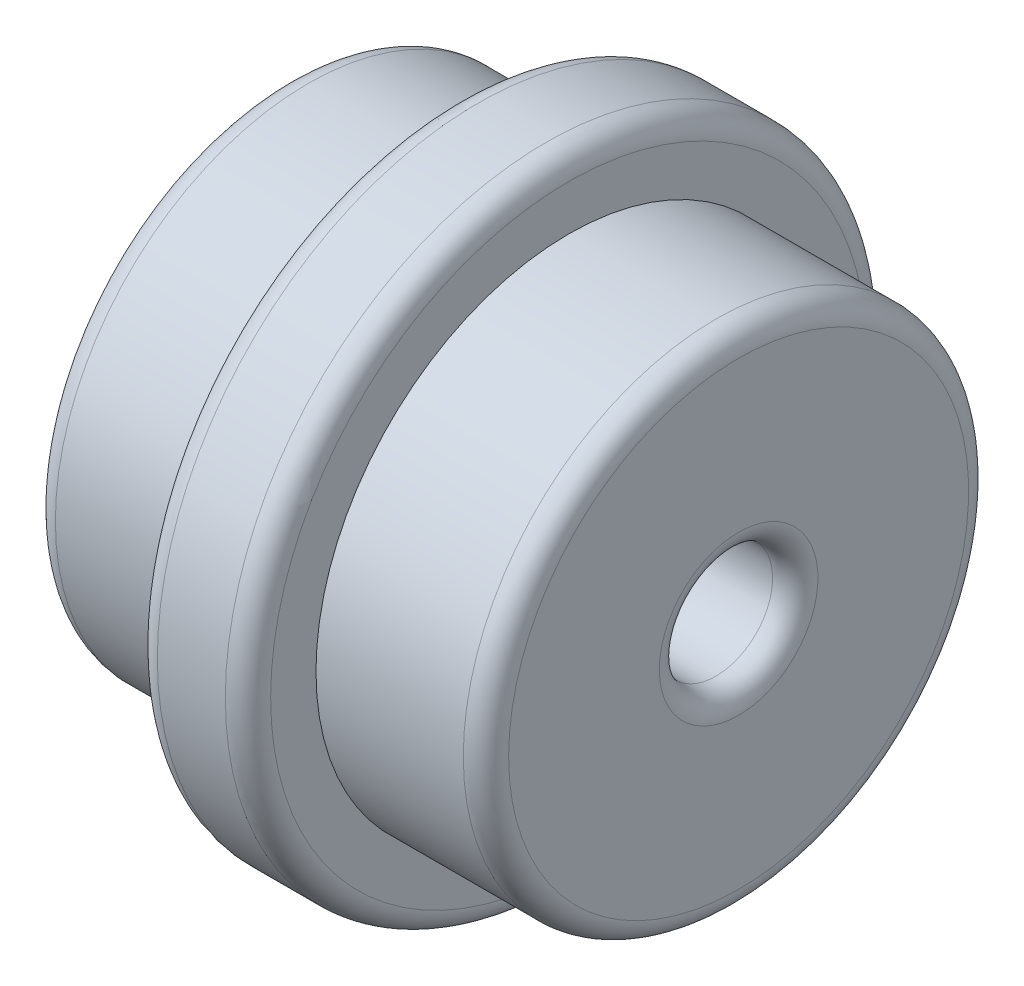
ISO-10303-21;
HEADER;
FILE_DESCRIPTION(('STEP AP214'),'2;1');
FILE_NAME('part.step','',(''),(''),'','','');
FILE_SCHEMA(('AUTOMOTIVE_DESIGN { 1 0 10303 214 1 1 1 1 }'));
ENDSEC;
DATA;
#1=APPLICATION_CONTEXT('core data for automotive mechanical design processes');
#2=APPLICATION_PROTOCOL_DEFINITION('international standard','automotive_design',2000,#1);
#3=PRODUCT_CONTEXT('',#1,'mechanical');
#4=PRODUCT('Part','Part','',(#3));
#5=PRODUCT_RELATED_PRODUCT_CATEGORY('part','',(#4));
#6=PRODUCT_DEFINITION_FORMATION('','',#4);
#7=PRODUCT_DEFINITION_CONTEXT('part definition',#1,'design');
#8=PRODUCT_DEFINITION('design','',#6,#7);
#9=PRODUCT_DEFINITION_SHAPE('','',#8);
#10=(LENGTH_UNIT() NAMED_UNIT(*) SI_UNIT(.MILLI.,.METRE.));
#11=(NAMED_UNIT(*) PLANE_ANGLE_UNIT() SI_UNIT($,.RADIAN.));
#12=(NAMED_UNIT(*) SI_UNIT($,.STERADIAN.) SOLID_ANGLE_UNIT());
#13=UNCERTAINTY_MEASURE_WITH_UNIT(LENGTH_MEASURE(1.E-05),#10,'distance_accuracy_value','');
#14=(GEOMETRIC_REPRESENTATION_CONTEXT(3) GLOBAL_UNCERTAINTY_ASSIGNED_CONTEXT((#13)) GLOBAL_UNIT_ASSIGNED_CONTEXT((#10,
#11,#12)) REPRESENTATION_CONTEXT('',''));
#15=CARTESIAN_POINT('',(0.,0.,0.));
#16=DIRECTION('',(0.,0.,1.));
#17=DIRECTION('',(1.,0.,0.));
#18=AXIS2_PLACEMENT_3D('',#15,#16,#17);
#19=CARTESIAN_POINT('',(-10.,11.15,0.));
#20=DIRECTION('',(1.,0.,0.));
#21=DIRECTION('',(0.,0.,-1.));
#22=AXIS2_PLACEMENT_3D('',#19,#20,#21);
#23=PLANE('',#22);
#24=CARTESIAN_POINT('',(-10.,0.,0.));
#25=DIRECTION('',(1.,0.,0.));
#26=DIRECTION('',(0.,0.,-1.));
#27=AXIS2_PLACEMENT_3D('',#24,#25,#26);
#28=CIRCLE('',#27,3.5);
#29=CARTESIAN_POINT('',(-10.,0.,-3.5));
#30=VERTEX_POINT('',#29);
#31=EDGE_CURVE('E37',#30,#30,#28,.T.);
#32=ORIENTED_EDGE('',*,*,#31,.T.);
#33=EDGE_LOOP('',(#32));
#34=FACE_BOUND('',#33,.T.);
#35=CARTESIAN_POINT('',(-10.,0.,0.));
#36=DIRECTION('',(1.,0.,0.));
#37=DIRECTION('',(0.,0.,-1.));
#38=AXIS2_PLACEMENT_3D('',#35,#36,#37);
#39=CIRCLE('',#38,10.15);
#40=CARTESIAN_POINT('',(-10.,0.,-10.15));
#41=VERTEX_POINT('',#40);
#42=EDGE_CURVE('E65',#41,#41,#39,.F.);
#43=ORIENTED_EDGE('',*,*,#42,.T.);
#44=EDGE_LOOP('',(#43));
#45=FACE_BOUND('',#44,.T.);
#46=ADVANCED_FACE('F30',(#34,#45),#23,.F.);
#47=CARTESIAN_POINT('',(10.,0.,0.));
#48=DIRECTION('',(-1.,0.,0.));
#49=DIRECTION('',(0.,0.,1.));
#50=AXIS2_PLACEMENT_3D('',#47,#48,#49);
#51=PLANE('',#50);
#52=CARTESIAN_POINT('',(10.,0.,0.));
#53=DIRECTION('',(-1.,0.,0.));
#54=DIRECTION('',(0.,0.,1.));
#55=AXIS2_PLACEMENT_3D('',#52,#53,#54);
#56=CIRCLE('',#55,3.5);
#57=CARTESIAN_POINT('',(10.,0.,3.5));
#58=VERTEX_POINT('',#57);
#59=EDGE_CURVE('E10',#58,#58,#56,.T.);
#60=ORIENTED_EDGE('',*,*,#59,.T.);
#61=EDGE_LOOP('',(#60));
#62=FACE_BOUND('',#61,.T.);
#63=CARTESIAN_POINT('',(10.,0.,0.));
#64=DIRECTION('',(-1.,0.,0.));
#65=DIRECTION('',(0.,0.,1.));
#66=AXIS2_PLACEMENT_3D('',#63,#64,#65);
#67=CIRCLE('',#66,10.15);
#68=CARTESIAN_POINT('',(10.,0.,10.15));
#69=VERTEX_POINT('',#68);
#70=EDGE_CURVE('E68',#69,#69,#67,.F.);
#71=ORIENTED_EDGE('',*,*,#70,.T.);
#72=EDGE_LOOP('',(#71));
#73=FACE_BOUND('',#72,.T.);
#74=ADVANCED_FACE('F99',(#62,#73),#51,.F.);
#75=CARTESIAN_POINT('',(-10.,0.,0.));
#76=DIRECTION('',(-1.,0.,0.));
#77=DIRECTION('',(0.,0.,1.));
#78=AXIS2_PLACEMENT_3D('',#75,#76,#77);
#79=CYLINDRICAL_SURFACE('',#78,11.15);
#80=CARTESIAN_POINT('',(9.,0.,0.));
#81=DIRECTION('',(-1.,0.,0.));
#82=DIRECTION('',(0.,0.,1.));
#83=AXIS2_PLACEMENT_3D('',#80,#81,#82);
#84=CIRCLE('',#83,11.15);
#85=CARTESIAN_POINT('',(9.,0.,11.15));
#86=VERTEX_POINT('',#85);
#87=EDGE_CURVE('E71',#86,#86,#84,.T.);
#88=ORIENTED_EDGE('',*,*,#87,.T.);
#89=EDGE_LOOP('',(#88));
#90=FACE_BOUND('',#89,.T.);
#91=CARTESIAN_POINT('',(2.5,0.,0.));
#92=DIRECTION('',(-1.,0.,0.));
#93=DIRECTION('',(0.,0.,1.));
#94=AXIS2_PLACEMENT_3D('',#91,#92,#93);
#95=CIRCLE('',#94,11.15);
#96=CARTESIAN_POINT('',(2.5,0.,11.15));
#97=VERTEX_POINT('',#96);
#98=EDGE_CURVE('E74',#97,#97,#95,.T.);
#99=ORIENTED_EDGE('',*,*,#98,.F.);
#100=EDGE_LOOP('',(#99));
#101=FACE_BOUND('',#100,.T.);
#102=ADVANCED_FACE('F104',(#90,#101),#79,.T.);
#103=CARTESIAN_POINT('',(2.5,11.15,0.));
#104=DIRECTION('',(-1.,0.,0.));
#105=DIRECTION('',(0.,0.,1.));
#106=AXIS2_PLACEMENT_3D('',#103,#104,#105);
#107=PLANE('',#106);
#108=CARTESIAN_POINT('',(2.5,0.,0.));
#109=DIRECTION('',(-1.,0.,0.));
#110=DIRECTION('',(0.,0.,1.));
#111=AXIS2_PLACEMENT_3D('',#108,#109,#110);
#112=CIRCLE('',#111,13.15);
#113=CARTESIAN_POINT('',(2.5,0.,13.15));
#114=VERTEX_POINT('',#113);
#115=EDGE_CURVE('E53',#114,#114,#112,.F.);
#116=ORIENTED_EDGE('',*,*,#115,.T.);
#117=EDGE_LOOP('',(#116));
#118=FACE_BOUND('',#117,.T.);
#119=ORIENTED_EDGE('',*,*,#98,.T.);
#120=EDGE_LOOP('',(#119));
#121=FACE_BOUND('',#120,.T.);
#122=ADVANCED_FACE('F95',(#118,#121),#107,.F.);
#123=CARTESIAN_POINT('',(-10.,0.,0.));
#124=DIRECTION('',(-1.,0.,0.));
#125=DIRECTION('',(0.,0.,1.));
#126=AXIS2_PLACEMENT_3D('',#123,#124,#125);
#127=CYLINDRICAL_SURFACE('',#126,14.15);
#128=CARTESIAN_POINT('',(1.5,0.,0.));
#129=DIRECTION('',(-1.,0.,0.));
#130=DIRECTION('',(0.,0.,1.));
#131=AXIS2_PLACEMENT_3D('',#128,#129,#130);
#132=CIRCLE('',#131,14.15);
#133=CARTESIAN_POINT('',(1.5,0.,14.15));
#134=VERTEX_POINT('',#133);
#135=EDGE_CURVE('E56',#134,#134,#132,.T.);
#136=ORIENTED_EDGE('',*,*,#135,.T.);
#137=EDGE_LOOP('',(#136));
#138=FACE_BOUND('',#137,.T.);
#139=CARTESIAN_POINT('',(-1.5,0.,0.));
#140=DIRECTION('',(1.,0.,0.));
#141=DIRECTION('',(0.,0.,-1.));
#142=AXIS2_PLACEMENT_3D('',#139,#140,#141);
#143=CIRCLE('',#142,14.15);
#144=CARTESIAN_POINT('',(-1.5,0.,-14.15));
#145=VERTEX_POINT('',#144);
#146=EDGE_CURVE('E59',#145,#145,#143,.T.);
#147=ORIENTED_EDGE('',*,*,#146,.T.);
#148=EDGE_LOOP('',(#147));
#149=FACE_BOUND('',#148,.T.);
#150=ADVANCED_FACE('F85',(#138,#149),#127,.T.);
#151=CARTESIAN_POINT('',(-2.5,14.15,0.));
#152=DIRECTION('',(1.,0.,0.));
#153=DIRECTION('',(0.,0.,-1.));
#154=AXIS2_PLACEMENT_3D('',#151,#152,#153);
#155=PLANE('',#154);
#156=CARTESIAN_POINT('',(-2.5,0.,0.));
#157=DIRECTION('',(1.,0.,0.));
#158=DIRECTION('',(0.,0.,-1.));
#159=AXIS2_PLACEMENT_3D('',#156,#157,#158);
#160=CIRCLE('',#159,13.15);
#161=CARTESIAN_POINT('',(-2.5,0.,-13.15));
#162=VERTEX_POINT('',#161);
#163=EDGE_CURVE('E50',#162,#162,#160,.F.);
#164=ORIENTED_EDGE('',*,*,#163,.T.);
#165=EDGE_LOOP('',(#164));
#166=FACE_BOUND('',#165,.T.);
#167=CARTESIAN_POINT('',(-2.5,0.,0.));
#168=DIRECTION('',(-1.,0.,0.));
#169=DIRECTION('',(0.,0.,1.));
#170=AXIS2_PLACEMENT_3D('',#167,#168,#169);
#171=CIRCLE('',#170,11.15);
#172=CARTESIAN_POINT('',(-2.5,0.,11.15));
#173=VERTEX_POINT('',#172);
#174=EDGE_CURVE('E77',#173,#173,#171,.T.);
#175=ORIENTED_EDGE('',*,*,#174,.F.);
#176=EDGE_LOOP('',(#175));
#177=FACE_BOUND('',#176,.T.);
#178=ADVANCED_FACE('F83',(#166,#177),#155,.F.);
#179=CARTESIAN_POINT('',(-10.,0.,0.));
#180=DIRECTION('',(-1.,0.,0.));
#181=DIRECTION('',(0.,0.,1.));
#182=AXIS2_PLACEMENT_3D('',#179,#180,#181);
#183=CYLINDRICAL_SURFACE('',#182,11.15);
#184=CARTESIAN_POINT('',(-9.,0.,0.));
#185=DIRECTION('',(1.,0.,0.));
#186=DIRECTION('',(0.,0.,-1.));
#187=AXIS2_PLACEMENT_3D('',#184,#185,#186);
#188=CIRCLE('',#187,11.15);
#189=CARTESIAN_POINT('',(-9.,0.,-11.15));
#190=VERTEX_POINT('',#189);
#191=EDGE_CURVE('E62',#190,#190,#188,.T.);
#192=ORIENTED_EDGE('',*,*,#191,.T.);
#193=EDGE_LOOP('',(#192));
#194=FACE_BOUND('',#193,.T.);
#195=ORIENTED_EDGE('',*,*,#174,.T.);
#196=EDGE_LOOP('',(#195));
#197=FACE_BOUND('',#196,.T.);
#198=ADVANCED_FACE('F81',(#194,#197),#183,.T.);
#199=CARTESIAN_POINT('',(9.,0.,0.));
#200=DIRECTION('',(-1.,0.,0.));
#201=DIRECTION('',(0.,0.,1.));
#202=AXIS2_PLACEMENT_3D('',#199,#200,#201);
#203=TOROIDAL_SURFACE('',#202,10.15,1.);
#204=ORIENTED_EDGE('',*,*,#70,.F.);
#205=EDGE_LOOP('',(#204));
#206=FACE_BOUND('',#205,.T.);
#207=ORIENTED_EDGE('',*,*,#87,.F.);
#208=EDGE_LOOP('',(#207));
#209=FACE_BOUND('',#208,.T.);
#210=ADVANCED_FACE('F92',(#206,#209),#203,.T.);
#211=CARTESIAN_POINT('',(-9.,0.,0.));
#212=DIRECTION('',(1.,0.,0.));
#213=DIRECTION('',(0.,0.,-1.));
#214=AXIS2_PLACEMENT_3D('',#211,#212,#213);
#215=TOROIDAL_SURFACE('',#214,10.15,1.);
#216=ORIENTED_EDGE('',*,*,#191,.F.);
#217=EDGE_LOOP('',(#216));
#218=FACE_BOUND('',#217,.T.);
#219=ORIENTED_EDGE('',*,*,#42,.F.);
#220=EDGE_LOOP('',(#219));
#221=FACE_BOUND('',#220,.T.);
#222=ADVANCED_FACE('F111',(#218,#221),#215,.T.);
#223=CARTESIAN_POINT('',(1.5,0.,0.));
#224=DIRECTION('',(-1.,0.,0.));
#225=DIRECTION('',(0.,0.,1.));
#226=AXIS2_PLACEMENT_3D('',#223,#224,#225);
#227=TOROIDAL_SURFACE('',#226,13.15,1.);
#228=ORIENTED_EDGE('',*,*,#115,.F.);
#229=EDGE_LOOP('',(#228));
#230=FACE_BOUND('',#229,.T.);
#231=ORIENTED_EDGE('',*,*,#135,.F.);
#232=EDGE_LOOP('',(#231));
#233=FACE_BOUND('',#232,.T.);
#234=ADVANCED_FACE('F115',(#230,#233),#227,.T.);
#235=CARTESIAN_POINT('',(-1.5,0.,0.));
#236=DIRECTION('',(1.,0.,0.));
#237=DIRECTION('',(0.,0.,-1.));
#238=AXIS2_PLACEMENT_3D('',#235,#236,#237);
#239=TOROIDAL_SURFACE('',#238,13.15,1.);
#240=ORIENTED_EDGE('',*,*,#146,.F.);
#241=EDGE_LOOP('',(#240));
#242=FACE_BOUND('',#241,.T.);
#243=ORIENTED_EDGE('',*,*,#163,.F.);
#244=EDGE_LOOP('',(#243));
#245=FACE_BOUND('',#244,.T.);
#246=ADVANCED_FACE('F119',(#242,#245),#239,.T.);
#247=CARTESIAN_POINT('',(10.,0.,0.));
#248=DIRECTION('',(-1.,0.,0.));
#249=DIRECTION('',(0.,0.,1.));
#250=AXIS2_PLACEMENT_3D('',#247,#248,#249);
#251=CYLINDRICAL_SURFACE('',#250,2.5);
#252=CARTESIAN_POINT('',(-9.,0.,0.));
#253=DIRECTION('',(1.,0.,0.));
#254=DIRECTION('',(0.,0.,-1.));
#255=AXIS2_PLACEMENT_3D('',#252,#253,#254);
#256=CIRCLE('',#255,2.5);
#257=CARTESIAN_POINT('',(-9.,0.,-2.5));
#258=VERTEX_POINT('',#257);
#259=EDGE_CURVE('E41',#258,#258,#256,.F.);
#260=ORIENTED_EDGE('',*,*,#259,.T.);
#261=EDGE_LOOP('',(#260));
#262=FACE_BOUND('',#261,.T.);
#263=CARTESIAN_POINT('',(9.,0.,0.));
#264=DIRECTION('',(-1.,0.,0.));
#265=DIRECTION('',(0.,0.,1.));
#266=AXIS2_PLACEMENT_3D('',#263,#264,#265);
#267=CIRCLE('',#266,2.5);
#268=CARTESIAN_POINT('',(9.,0.,2.5));
#269=VERTEX_POINT('',#268);
#270=EDGE_CURVE('E45',#269,#269,#267,.F.);
#271=ORIENTED_EDGE('',*,*,#270,.T.);
#272=EDGE_LOOP('',(#271));
#273=FACE_BOUND('',#272,.T.);
#274=ADVANCED_FACE('F122',(#262,#273),#251,.F.);
#275=CARTESIAN_POINT('',(-9.,0.,0.));
#276=DIRECTION('',(1.,0.,0.));
#277=DIRECTION('',(0.,0.,-1.));
#278=AXIS2_PLACEMENT_3D('',#275,#276,#277);
#279=TOROIDAL_SURFACE('',#278,3.5,1.);
#280=ORIENTED_EDGE('',*,*,#31,.F.);
#281=EDGE_LOOP('',(#280));
#282=FACE_BOUND('',#281,.T.);
#283=ORIENTED_EDGE('',*,*,#259,.F.);
#284=EDGE_LOOP('',(#283));
#285=FACE_BOUND('',#284,.T.);
#286=ADVANCED_FACE('F124',(#282,#285),#279,.T.);
#287=CARTESIAN_POINT('',(9.,0.,0.));
#288=DIRECTION('',(-1.,0.,0.));
#289=DIRECTION('',(0.,0.,1.));
#290=AXIS2_PLACEMENT_3D('',#287,#288,#289);
#291=TOROIDAL_SURFACE('',#290,3.5,1.);
#292=ORIENTED_EDGE('',*,*,#270,.F.);
#293=EDGE_LOOP('',(#292));
#294=FACE_BOUND('',#293,.T.);
#295=ORIENTED_EDGE('',*,*,#59,.F.);
#296=EDGE_LOOP('',(#295));
#297=FACE_BOUND('',#296,.T.);
#298=ADVANCED_FACE('F32',(#294,#297),#291,.T.);
#299=CLOSED_SHELL('',(#46,#74,#102,#122,#150,#178,#198,#210,#222,#234,#246,#274,#286,#298));
#300=MANIFOLD_SOLID_BREP('B2',#299);
#301=ADVANCED_BREP_SHAPE_REPRESENTATION('',(#18,#300),#14);
#302=SHAPE_DEFINITION_REPRESENTATION(#9,#301);
ENDSEC;
END-ISO-10303-21;
